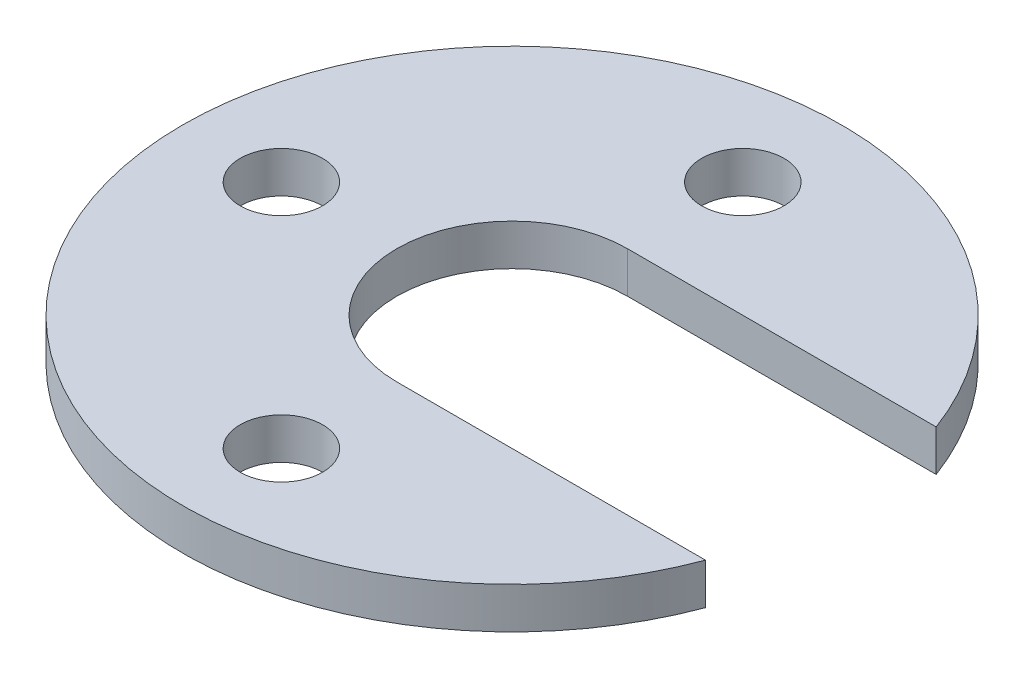
ISO-10303-21;
HEADER;
FILE_DESCRIPTION(('STEP AP214'),'2;1');
FILE_NAME('part.step','',(''),(''),'','','');
FILE_SCHEMA(('AUTOMOTIVE_DESIGN { 1 0 10303 214 1 1 1 1 }'));
ENDSEC;
DATA;
#1=APPLICATION_CONTEXT('core data for automotive mechanical design processes');
#2=APPLICATION_PROTOCOL_DEFINITION('international standard','automotive_design',2000,#1);
#3=PRODUCT_CONTEXT('',#1,'mechanical');
#4=PRODUCT('Part','Part','',(#3));
#5=PRODUCT_RELATED_PRODUCT_CATEGORY('part','',(#4));
#6=PRODUCT_DEFINITION_FORMATION('','',#4);
#7=PRODUCT_DEFINITION_CONTEXT('part definition',#1,'design');
#8=PRODUCT_DEFINITION('design','',#6,#7);
#9=PRODUCT_DEFINITION_SHAPE('','',#8);
#10=(LENGTH_UNIT() NAMED_UNIT(*) SI_UNIT(.MILLI.,.METRE.));
#11=(NAMED_UNIT(*) PLANE_ANGLE_UNIT() SI_UNIT($,.RADIAN.));
#12=(NAMED_UNIT(*) SI_UNIT($,.STERADIAN.) SOLID_ANGLE_UNIT());
#13=UNCERTAINTY_MEASURE_WITH_UNIT(LENGTH_MEASURE(1.E-05),#10,'distance_accuracy_value','');
#14=(GEOMETRIC_REPRESENTATION_CONTEXT(3) GLOBAL_UNCERTAINTY_ASSIGNED_CONTEXT((#13)) GLOBAL_UNIT_ASSIGNED_CONTEXT((#10,
#11,#12)) REPRESENTATION_CONTEXT('',''));
#15=CARTESIAN_POINT('',(0.,0.,0.));
#16=DIRECTION('',(0.,0.,1.));
#17=DIRECTION('',(1.,0.,0.));
#18=AXIS2_PLACEMENT_3D('',#15,#16,#17);
#19=CARTESIAN_POINT('',(0.,5.,0.));
#20=DIRECTION('',(0.,1.,0.));
#21=DIRECTION('',(0.,0.,1.));
#22=AXIS2_PLACEMENT_3D('',#19,#20,#21);
#23=PLANE('',#22);
#24=CARTESIAN_POINT('',(0.,5.,28.));
#25=DIRECTION('',(0.,1.,0.));
#26=DIRECTION('',(0.,0.,1.));
#27=AXIS2_PLACEMENT_3D('',#24,#25,#26);
#28=CIRCLE('',#27,5.);
#29=CARTESIAN_POINT('',(0.,5.,33.));
#30=VERTEX_POINT('',#29);
#31=EDGE_CURVE('E121',#30,#30,#28,.T.);
#32=ORIENTED_EDGE('',*,*,#31,.F.);
#33=EDGE_LOOP('',(#32));
#34=FACE_BOUND('',#33,.T.);
#35=CARTESIAN_POINT('',(0.,5.,0.));
#36=DIRECTION('',(0.,-1.,0.));
#37=DIRECTION('',(0.,0.,1.));
#38=AXIS2_PLACEMENT_3D('',#35,#36,#37);
#39=CIRCLE('',#38,14.);
#40=CARTESIAN_POINT('',(0.,5.,14.));
#41=VERTEX_POINT('',#40);
#42=CARTESIAN_POINT('',(0.,5.,-14.));
#43=VERTEX_POINT('',#42);
#44=EDGE_CURVE('E91',#41,#43,#39,.T.);
#45=ORIENTED_EDGE('',*,*,#44,.T.);
#46=DIRECTION('',(1.,0.,0.));
#47=VECTOR('',#46,1.);
#48=CARTESIAN_POINT('',(0.,5.,-14.));
#49=LINE('',#48,#47);
#50=CARTESIAN_POINT('',(37.4699879903904,5.,-14.));
#51=VERTEX_POINT('',#50);
#52=EDGE_CURVE('E86',#43,#51,#49,.T.);
#53=ORIENTED_EDGE('',*,*,#52,.T.);
#54=CARTESIAN_POINT('',(0.,5.,0.));
#55=DIRECTION('',(0.,1.,0.));
#56=DIRECTION('',(0.,0.,1.));
#57=AXIS2_PLACEMENT_3D('',#54,#55,#56);
#58=CIRCLE('',#57,40.);
#59=CARTESIAN_POINT('',(37.4699879903904,5.,14.));
#60=VERTEX_POINT('',#59);
#61=EDGE_CURVE('E89',#51,#60,#58,.T.);
#62=ORIENTED_EDGE('',*,*,#61,.T.);
#63=DIRECTION('',(-1.,0.,0.));
#64=VECTOR('',#63,1.);
#65=CARTESIAN_POINT('',(0.,5.,14.));
#66=LINE('',#65,#64);
#67=EDGE_CURVE('E56',#60,#41,#66,.T.);
#68=ORIENTED_EDGE('',*,*,#67,.T.);
#69=EDGE_LOOP('',(#45,#53,#62,#68));
#70=FACE_BOUND('',#69,.T.);
#71=CARTESIAN_POINT('',(0.,5.,-28.));
#72=DIRECTION('',(0.,1.,0.));
#73=DIRECTION('',(0.,0.,1.));
#74=AXIS2_PLACEMENT_3D('',#71,#72,#73);
#75=CIRCLE('',#74,5.);
#76=CARTESIAN_POINT('',(0.,5.,-23.));
#77=VERTEX_POINT('',#76);
#78=EDGE_CURVE('E106',#77,#77,#75,.T.);
#79=ORIENTED_EDGE('',*,*,#78,.F.);
#80=EDGE_LOOP('',(#79));
#81=FACE_BOUND('',#80,.T.);
#82=CARTESIAN_POINT('',(-28.,5.,0.));
#83=DIRECTION('',(0.,1.,0.));
#84=DIRECTION('',(0.,0.,1.));
#85=AXIS2_PLACEMENT_3D('',#82,#83,#84);
#86=CIRCLE('',#85,5.);
#87=CARTESIAN_POINT('',(-28.,5.,5.));
#88=VERTEX_POINT('',#87);
#89=EDGE_CURVE('E127',#88,#88,#86,.T.);
#90=ORIENTED_EDGE('',*,*,#89,.F.);
#91=EDGE_LOOP('',(#90));
#92=FACE_BOUND('',#91,.T.);
#93=ADVANCED_FACE('F39',(#34,#70,#81,#92),#23,.T.);
#94=CARTESIAN_POINT('',(0.,0.,0.));
#95=DIRECTION('',(0.,1.,0.));
#96=DIRECTION('',(0.,0.,1.));
#97=AXIS2_PLACEMENT_3D('',#94,#95,#96);
#98=PLANE('',#97);
#99=CARTESIAN_POINT('',(0.,0.,0.));
#100=DIRECTION('',(0.,-1.,0.));
#101=DIRECTION('',(0.,0.,1.));
#102=AXIS2_PLACEMENT_3D('',#99,#100,#101);
#103=CIRCLE('',#102,14.);
#104=CARTESIAN_POINT('',(0.,0.,14.));
#105=VERTEX_POINT('',#104);
#106=CARTESIAN_POINT('',(0.,0.,-14.));
#107=VERTEX_POINT('',#106);
#108=EDGE_CURVE('E103',#105,#107,#103,.T.);
#109=ORIENTED_EDGE('',*,*,#108,.F.);
#110=DIRECTION('',(-1.,0.,0.));
#111=VECTOR('',#110,1.);
#112=CARTESIAN_POINT('',(0.,0.,14.));
#113=LINE('',#112,#111);
#114=CARTESIAN_POINT('',(37.4699879903904,0.,14.));
#115=VERTEX_POINT('',#114);
#116=EDGE_CURVE('E79',#115,#105,#113,.T.);
#117=ORIENTED_EDGE('',*,*,#116,.F.);
#118=CARTESIAN_POINT('',(0.,0.,0.));
#119=DIRECTION('',(0.,1.,0.));
#120=DIRECTION('',(0.,0.,1.));
#121=AXIS2_PLACEMENT_3D('',#118,#119,#120);
#122=CIRCLE('',#121,40.);
#123=CARTESIAN_POINT('',(37.4699879903904,0.,-14.));
#124=VERTEX_POINT('',#123);
#125=EDGE_CURVE('E73',#124,#115,#122,.T.);
#126=ORIENTED_EDGE('',*,*,#125,.F.);
#127=DIRECTION('',(1.,0.,0.));
#128=VECTOR('',#127,1.);
#129=CARTESIAN_POINT('',(0.,0.,-14.));
#130=LINE('',#129,#128);
#131=EDGE_CURVE('E95',#107,#124,#130,.T.);
#132=ORIENTED_EDGE('',*,*,#131,.F.);
#133=EDGE_LOOP('',(#109,#117,#126,#132));
#134=FACE_BOUND('',#133,.T.);
#135=CARTESIAN_POINT('',(0.,0.,-28.));
#136=DIRECTION('',(0.,1.,0.));
#137=DIRECTION('',(0.,0.,1.));
#138=AXIS2_PLACEMENT_3D('',#135,#136,#137);
#139=CIRCLE('',#138,5.);
#140=CARTESIAN_POINT('',(0.,0.,-23.));
#141=VERTEX_POINT('',#140);
#142=EDGE_CURVE('E118',#141,#141,#139,.T.);
#143=ORIENTED_EDGE('',*,*,#142,.T.);
#144=EDGE_LOOP('',(#143));
#145=FACE_BOUND('',#144,.T.);
#146=CARTESIAN_POINT('',(0.,0.,28.));
#147=DIRECTION('',(0.,1.,0.));
#148=DIRECTION('',(0.,0.,1.));
#149=AXIS2_PLACEMENT_3D('',#146,#147,#148);
#150=CIRCLE('',#149,5.);
#151=CARTESIAN_POINT('',(0.,0.,33.));
#152=VERTEX_POINT('',#151);
#153=EDGE_CURVE('E124',#152,#152,#150,.T.);
#154=ORIENTED_EDGE('',*,*,#153,.T.);
#155=EDGE_LOOP('',(#154));
#156=FACE_BOUND('',#155,.T.);
#157=CARTESIAN_POINT('',(-28.,0.,0.));
#158=DIRECTION('',(0.,1.,0.));
#159=DIRECTION('',(0.,0.,1.));
#160=AXIS2_PLACEMENT_3D('',#157,#158,#159);
#161=CIRCLE('',#160,5.);
#162=CARTESIAN_POINT('',(-28.,0.,5.));
#163=VERTEX_POINT('',#162);
#164=EDGE_CURVE('E130',#163,#163,#161,.T.);
#165=ORIENTED_EDGE('',*,*,#164,.T.);
#166=EDGE_LOOP('',(#165));
#167=FACE_BOUND('',#166,.T.);
#168=ADVANCED_FACE('F114',(#134,#145,#156,#167),#98,.F.);
#169=CARTESIAN_POINT('',(0.,5.,0.));
#170=DIRECTION('',(0.,-1.,0.));
#171=DIRECTION('',(0.,0.,-1.));
#172=AXIS2_PLACEMENT_3D('',#169,#170,#171);
#173=CYLINDRICAL_SURFACE('',#172,14.);
#174=ORIENTED_EDGE('',*,*,#108,.T.);
#175=DIRECTION('',(0.,-1.,0.));
#176=VECTOR('',#175,1.);
#177=CARTESIAN_POINT('',(0.,5.,-14.));
#178=LINE('',#177,#176);
#179=EDGE_CURVE('E11',#43,#107,#178,.T.);
#180=ORIENTED_EDGE('',*,*,#179,.F.);
#181=ORIENTED_EDGE('',*,*,#44,.F.);
#182=DIRECTION('',(0.,-1.,0.));
#183=VECTOR('',#182,1.);
#184=CARTESIAN_POINT('',(0.,5.,14.));
#185=LINE('',#184,#183);
#186=EDGE_CURVE('E99',#41,#105,#185,.T.);
#187=ORIENTED_EDGE('',*,*,#186,.T.);
#188=EDGE_LOOP('',(#174,#180,#181,#187));
#189=FACE_BOUND('',#188,.T.);
#190=ADVANCED_FACE('F41',(#189),#173,.F.);
#191=CARTESIAN_POINT('',(0.,5.,-14.));
#192=DIRECTION('',(0.,0.,-1.));
#193=DIRECTION('',(-1.,0.,0.));
#194=AXIS2_PLACEMENT_3D('',#191,#192,#193);
#195=PLANE('',#194);
#196=ORIENTED_EDGE('',*,*,#131,.T.);
#197=DIRECTION('',(0.,-1.,0.));
#198=VECTOR('',#197,1.);
#199=CARTESIAN_POINT('',(37.4699879903904,5.,-14.));
#200=LINE('',#199,#198);
#201=EDGE_CURVE('E48',#51,#124,#200,.T.);
#202=ORIENTED_EDGE('',*,*,#201,.F.);
#203=ORIENTED_EDGE('',*,*,#52,.F.);
#204=ORIENTED_EDGE('',*,*,#179,.T.);
#205=EDGE_LOOP('',(#196,#202,#203,#204));
#206=FACE_BOUND('',#205,.T.);
#207=ADVANCED_FACE('F94',(#206),#195,.F.);
#208=CARTESIAN_POINT('',(0.,5.,0.));
#209=DIRECTION('',(0.,-1.,0.));
#210=DIRECTION('',(0.,0.,-1.));
#211=AXIS2_PLACEMENT_3D('',#208,#209,#210);
#212=CYLINDRICAL_SURFACE('',#211,40.);
#213=ORIENTED_EDGE('',*,*,#125,.T.);
#214=DIRECTION('',(0.,-1.,0.));
#215=VECTOR('',#214,1.);
#216=CARTESIAN_POINT('',(37.4699879903904,5.,14.));
#217=LINE('',#216,#215);
#218=EDGE_CURVE('E96',#60,#115,#217,.T.);
#219=ORIENTED_EDGE('',*,*,#218,.F.);
#220=ORIENTED_EDGE('',*,*,#61,.F.);
#221=ORIENTED_EDGE('',*,*,#201,.T.);
#222=EDGE_LOOP('',(#213,#219,#220,#221));
#223=FACE_BOUND('',#222,.T.);
#224=ADVANCED_FACE('F97',(#223),#212,.T.);
#225=CARTESIAN_POINT('',(0.,5.,14.));
#226=DIRECTION('',(0.,0.,1.));
#227=DIRECTION('',(1.,0.,0.));
#228=AXIS2_PLACEMENT_3D('',#225,#226,#227);
#229=PLANE('',#228);
#230=ORIENTED_EDGE('',*,*,#116,.T.);
#231=ORIENTED_EDGE('',*,*,#186,.F.);
#232=ORIENTED_EDGE('',*,*,#67,.F.);
#233=ORIENTED_EDGE('',*,*,#218,.T.);
#234=EDGE_LOOP('',(#230,#231,#232,#233));
#235=FACE_BOUND('',#234,.T.);
#236=ADVANCED_FACE('F111',(#235),#229,.F.);
#237=CARTESIAN_POINT('',(0.,5.,-28.));
#238=DIRECTION('',(0.,-1.,0.));
#239=DIRECTION('',(0.,0.,-1.));
#240=AXIS2_PLACEMENT_3D('',#237,#238,#239);
#241=CYLINDRICAL_SURFACE('',#240,5.);
#242=ORIENTED_EDGE('',*,*,#78,.T.);
#243=EDGE_LOOP('',(#242));
#244=FACE_BOUND('',#243,.T.);
#245=ORIENTED_EDGE('',*,*,#142,.F.);
#246=EDGE_LOOP('',(#245));
#247=FACE_BOUND('',#246,.T.);
#248=ADVANCED_FACE('F148',(#244,#247),#241,.F.);
#249=CARTESIAN_POINT('',(0.,5.,28.));
#250=DIRECTION('',(0.,-1.,0.));
#251=DIRECTION('',(0.,0.,-1.));
#252=AXIS2_PLACEMENT_3D('',#249,#250,#251);
#253=CYLINDRICAL_SURFACE('',#252,5.);
#254=ORIENTED_EDGE('',*,*,#31,.T.);
#255=EDGE_LOOP('',(#254));
#256=FACE_BOUND('',#255,.T.);
#257=ORIENTED_EDGE('',*,*,#153,.F.);
#258=EDGE_LOOP('',(#257));
#259=FACE_BOUND('',#258,.T.);
#260=ADVANCED_FACE('F193',(#256,#259),#253,.F.);
#261=CARTESIAN_POINT('',(-28.,5.,0.));
#262=DIRECTION('',(0.,-1.,0.));
#263=DIRECTION('',(0.,0.,-1.));
#264=AXIS2_PLACEMENT_3D('',#261,#262,#263);
#265=CYLINDRICAL_SURFACE('',#264,5.);
#266=ORIENTED_EDGE('',*,*,#89,.T.);
#267=EDGE_LOOP('',(#266));
#268=FACE_BOUND('',#267,.T.);
#269=ORIENTED_EDGE('',*,*,#164,.F.);
#270=EDGE_LOOP('',(#269));
#271=FACE_BOUND('',#270,.T.);
#272=ADVANCED_FACE('F136',(#268,#271),#265,.F.);
#273=CLOSED_SHELL('',(#93,#168,#190,#207,#224,#236,#248,#260,#272));
#274=MANIFOLD_SOLID_BREP('B2',#273);
#275=ADVANCED_BREP_SHAPE_REPRESENTATION('',(#18,#274),#14);
#276=SHAPE_DEFINITION_REPRESENTATION(#9,#275);
ENDSEC;
END-ISO-10303-21;
